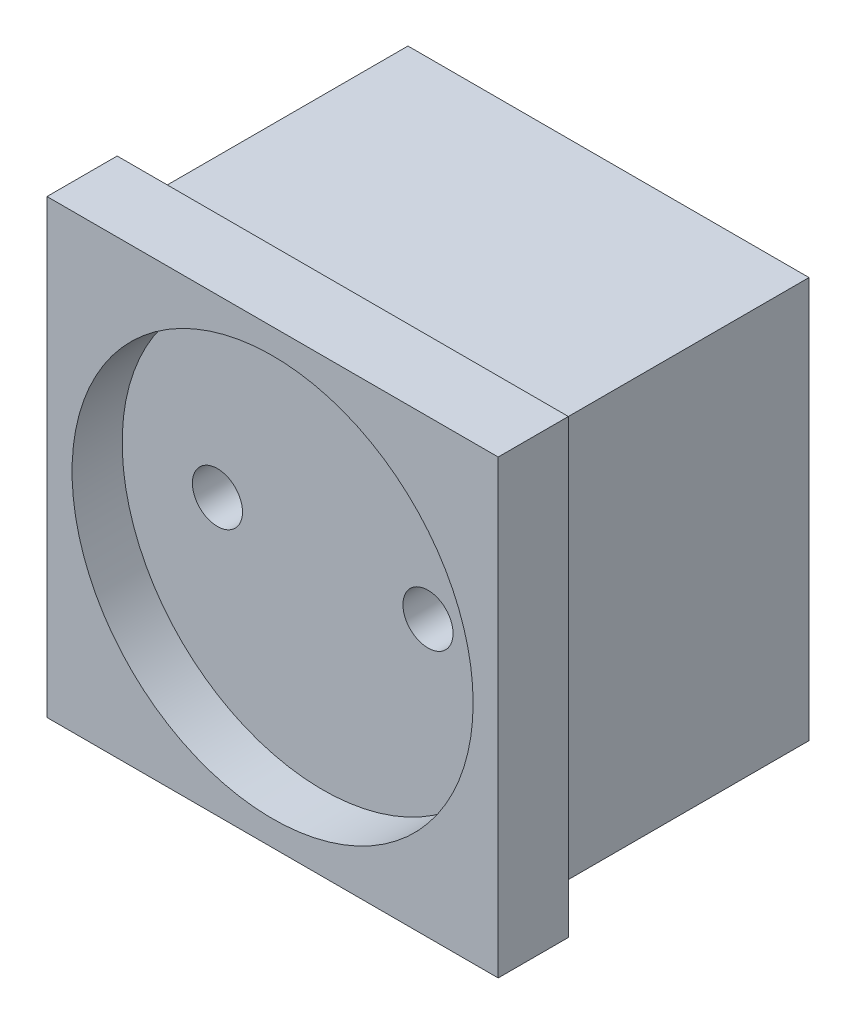
ISO-10303-21;
HEADER;
FILE_DESCRIPTION(('STEP AP214'),'2;1');
FILE_NAME('part.step','',(''),(''),'','','');
FILE_SCHEMA(('AUTOMOTIVE_DESIGN { 1 0 10303 214 1 1 1 1 }'));
ENDSEC;
DATA;
#1=APPLICATION_CONTEXT('core data for automotive mechanical design processes');
#2=APPLICATION_PROTOCOL_DEFINITION('international standard','automotive_design',2000,#1);
#3=PRODUCT_CONTEXT('',#1,'mechanical');
#4=PRODUCT('Part','Part','',(#3));
#5=PRODUCT_RELATED_PRODUCT_CATEGORY('part','',(#4));
#6=PRODUCT_DEFINITION_FORMATION('','',#4);
#7=PRODUCT_DEFINITION_CONTEXT('part definition',#1,'design');
#8=PRODUCT_DEFINITION('design','',#6,#7);
#9=PRODUCT_DEFINITION_SHAPE('','',#8);
#10=(LENGTH_UNIT() NAMED_UNIT(*) SI_UNIT(.MILLI.,.METRE.));
#11=(NAMED_UNIT(*) PLANE_ANGLE_UNIT() SI_UNIT($,.RADIAN.));
#12=(NAMED_UNIT(*) SI_UNIT($,.STERADIAN.) SOLID_ANGLE_UNIT());
#13=UNCERTAINTY_MEASURE_WITH_UNIT(LENGTH_MEASURE(1.E-05),#10,'distance_accuracy_value','');
#14=(GEOMETRIC_REPRESENTATION_CONTEXT(3) GLOBAL_UNCERTAINTY_ASSIGNED_CONTEXT((#13)) GLOBAL_UNIT_ASSIGNED_CONTEXT((#10,
#11,#12)) REPRESENTATION_CONTEXT('',''));
#15=CARTESIAN_POINT('',(0.,0.,0.));
#16=DIRECTION('',(0.,0.,1.));
#17=DIRECTION('',(1.,0.,0.));
#18=AXIS2_PLACEMENT_3D('',#15,#16,#17);
#19=CARTESIAN_POINT('',(20.,-20.,33.5));
#20=DIRECTION('',(-1.,0.,0.));
#21=DIRECTION('',(0.,0.,1.));
#22=AXIS2_PLACEMENT_3D('',#19,#20,#21);
#23=PLANE('',#22);
#24=DIRECTION('',(0.,1.,0.));
#25=VECTOR('',#24,1.);
#26=CARTESIAN_POINT('',(20.,-20.,26.5));
#27=LINE('',#26,#25);
#28=CARTESIAN_POINT('',(20.,-20.,26.5));
#29=VERTEX_POINT('',#28);
#30=CARTESIAN_POINT('',(20.,20.,26.5));
#31=VERTEX_POINT('',#30);
#32=EDGE_CURVE('E168',#29,#31,#27,.T.);
#33=ORIENTED_EDGE('',*,*,#32,.F.);
#34=DIRECTION('',(0.,0.,-1.));
#35=VECTOR('',#34,1.);
#36=CARTESIAN_POINT('',(20.,-20.,33.5));
#37=LINE('',#36,#35);
#38=CARTESIAN_POINT('',(20.,-20.,0.));
#39=VERTEX_POINT('',#38);
#40=EDGE_CURVE('E188',#29,#39,#37,.T.);
#41=ORIENTED_EDGE('',*,*,#40,.T.);
#42=DIRECTION('',(0.,1.,0.));
#43=VECTOR('',#42,1.);
#44=CARTESIAN_POINT('',(20.,-20.,0.));
#45=LINE('',#44,#43);
#46=CARTESIAN_POINT('',(20.,20.,0.));
#47=VERTEX_POINT('',#46);
#48=EDGE_CURVE('E172',#39,#47,#45,.T.);
#49=ORIENTED_EDGE('',*,*,#48,.T.);
#50=DIRECTION('',(0.,0.,-1.));
#51=VECTOR('',#50,1.);
#52=CARTESIAN_POINT('',(20.,20.,33.5));
#53=LINE('',#52,#51);
#54=EDGE_CURVE('E47',#31,#47,#53,.T.);
#55=ORIENTED_EDGE('',*,*,#54,.F.);
#56=EDGE_LOOP('',(#33,#41,#49,#55));
#57=FACE_BOUND('',#56,.T.);
#58=ADVANCED_FACE('F39',(#57),#23,.F.);
#59=CARTESIAN_POINT('',(-20.,20.,33.5));
#60=DIRECTION('',(0.,-1.,0.));
#61=DIRECTION('',(0.,0.,-1.));
#62=AXIS2_PLACEMENT_3D('',#59,#60,#61);
#63=PLANE('',#62);
#64=DIRECTION('',(-1.,0.,0.));
#65=VECTOR('',#64,1.);
#66=CARTESIAN_POINT('',(-20.,20.,26.5));
#67=LINE('',#66,#65);
#68=CARTESIAN_POINT('',(-20.,20.,26.5));
#69=VERTEX_POINT('',#68);
#70=EDGE_CURVE('E54',#31,#69,#67,.T.);
#71=ORIENTED_EDGE('',*,*,#70,.F.);
#72=ORIENTED_EDGE('',*,*,#54,.T.);
#73=DIRECTION('',(-1.,0.,0.));
#74=VECTOR('',#73,1.);
#75=CARTESIAN_POINT('',(-20.,20.,0.));
#76=LINE('',#75,#74);
#77=CARTESIAN_POINT('',(-20.,20.,0.));
#78=VERTEX_POINT('',#77);
#79=EDGE_CURVE('E176',#47,#78,#76,.T.);
#80=ORIENTED_EDGE('',*,*,#79,.T.);
#81=DIRECTION('',(0.,0.,-1.));
#82=VECTOR('',#81,1.);
#83=CARTESIAN_POINT('',(-20.,20.,33.5));
#84=LINE('',#83,#82);
#85=EDGE_CURVE('E194',#69,#78,#84,.T.);
#86=ORIENTED_EDGE('',*,*,#85,.F.);
#87=EDGE_LOOP('',(#71,#72,#80,#86));
#88=FACE_BOUND('',#87,.T.);
#89=ADVANCED_FACE('F198',(#88),#63,.F.);
#90=CARTESIAN_POINT('',(-20.,-20.,33.5));
#91=DIRECTION('',(1.,0.,0.));
#92=DIRECTION('',(0.,0.,-1.));
#93=AXIS2_PLACEMENT_3D('',#90,#91,#92);
#94=PLANE('',#93);
#95=DIRECTION('',(0.,-1.,0.));
#96=VECTOR('',#95,1.);
#97=CARTESIAN_POINT('',(-20.,-20.,26.5));
#98=LINE('',#97,#96);
#99=CARTESIAN_POINT('',(-20.,-20.,26.5));
#100=VERTEX_POINT('',#99);
#101=EDGE_CURVE('E62',#69,#100,#98,.T.);
#102=ORIENTED_EDGE('',*,*,#101,.F.);
#103=ORIENTED_EDGE('',*,*,#85,.T.);
#104=DIRECTION('',(0.,-1.,0.));
#105=VECTOR('',#104,1.);
#106=CARTESIAN_POINT('',(-20.,-20.,0.));
#107=LINE('',#106,#105);
#108=CARTESIAN_POINT('',(-20.,-20.,0.));
#109=VERTEX_POINT('',#108);
#110=EDGE_CURVE('E180',#78,#109,#107,.T.);
#111=ORIENTED_EDGE('',*,*,#110,.T.);
#112=DIRECTION('',(0.,0.,-1.));
#113=VECTOR('',#112,1.);
#114=CARTESIAN_POINT('',(-20.,-20.,33.5));
#115=LINE('',#114,#113);
#116=EDGE_CURVE('E191',#100,#109,#115,.T.);
#117=ORIENTED_EDGE('',*,*,#116,.F.);
#118=EDGE_LOOP('',(#102,#103,#111,#117));
#119=FACE_BOUND('',#118,.T.);
#120=ADVANCED_FACE('F208',(#119),#94,.F.);
#121=CARTESIAN_POINT('',(-20.,-20.,33.5));
#122=DIRECTION('',(0.,1.,0.));
#123=DIRECTION('',(0.,0.,1.));
#124=AXIS2_PLACEMENT_3D('',#121,#122,#123);
#125=PLANE('',#124);
#126=DIRECTION('',(1.,0.,0.));
#127=VECTOR('',#126,1.);
#128=CARTESIAN_POINT('',(-20.,-20.,26.5));
#129=LINE('',#128,#127);
#130=EDGE_CURVE('E11',#100,#29,#129,.T.);
#131=ORIENTED_EDGE('',*,*,#130,.F.);
#132=ORIENTED_EDGE('',*,*,#116,.T.);
#133=DIRECTION('',(1.,0.,0.));
#134=VECTOR('',#133,1.);
#135=CARTESIAN_POINT('',(-20.,-20.,0.));
#136=LINE('',#135,#134);
#137=EDGE_CURVE('E184',#109,#39,#136,.T.);
#138=ORIENTED_EDGE('',*,*,#137,.T.);
#139=ORIENTED_EDGE('',*,*,#40,.F.);
#140=EDGE_LOOP('',(#131,#132,#138,#139));
#141=FACE_BOUND('',#140,.T.);
#142=ADVANCED_FACE('F207',(#141),#125,.F.);
#143=CARTESIAN_POINT('',(0.,0.,0.));
#144=DIRECTION('',(0.,0.,-1.));
#145=DIRECTION('',(-1.,0.,0.));
#146=AXIS2_PLACEMENT_3D('',#143,#144,#145);
#147=PLANE('',#146);
#148=ORIENTED_EDGE('',*,*,#48,.F.);
#149=ORIENTED_EDGE('',*,*,#137,.F.);
#150=ORIENTED_EDGE('',*,*,#110,.F.);
#151=ORIENTED_EDGE('',*,*,#79,.F.);
#152=EDGE_LOOP('',(#148,#149,#150,#151));
#153=FACE_BOUND('',#152,.T.);
#154=ADVANCED_FACE('F204',(#153),#147,.T.);
#155=CARTESIAN_POINT('',(0.,0.,26.5));
#156=DIRECTION('',(0.,0.,1.));
#157=DIRECTION('',(1.,0.,0.));
#158=AXIS2_PLACEMENT_3D('',#155,#156,#157);
#159=PLANE('',#158);
#160=DIRECTION('',(0.,-1.,0.));
#161=VECTOR('',#160,1.);
#162=CARTESIAN_POINT('',(-22.5,-22.5,26.5));
#163=LINE('',#162,#161);
#164=CARTESIAN_POINT('',(-22.5,22.5,26.5));
#165=VERTEX_POINT('',#164);
#166=CARTESIAN_POINT('',(-22.5,-22.5,26.5));
#167=VERTEX_POINT('',#166);
#168=EDGE_CURVE('E125',#165,#167,#163,.T.);
#169=ORIENTED_EDGE('',*,*,#168,.F.);
#170=DIRECTION('',(-1.,0.,0.));
#171=VECTOR('',#170,1.);
#172=CARTESIAN_POINT('',(22.5,22.5,26.5));
#173=LINE('',#172,#171);
#174=CARTESIAN_POINT('',(22.5,22.5,26.5));
#175=VERTEX_POINT('',#174);
#176=EDGE_CURVE('E117',#175,#165,#173,.T.);
#177=ORIENTED_EDGE('',*,*,#176,.F.);
#178=DIRECTION('',(0.,1.,0.));
#179=VECTOR('',#178,1.);
#180=CARTESIAN_POINT('',(22.5,-22.5,26.5));
#181=LINE('',#180,#179);
#182=CARTESIAN_POINT('',(22.5,-22.5,26.5));
#183=VERTEX_POINT('',#182);
#184=EDGE_CURVE('E128',#183,#175,#181,.T.);
#185=ORIENTED_EDGE('',*,*,#184,.F.);
#186=DIRECTION('',(1.,0.,0.));
#187=VECTOR('',#186,1.);
#188=CARTESIAN_POINT('',(22.5,-22.5,26.5));
#189=LINE('',#188,#187);
#190=EDGE_CURVE('E108',#167,#183,#189,.T.);
#191=ORIENTED_EDGE('',*,*,#190,.F.);
#192=EDGE_LOOP('',(#169,#177,#185,#191));
#193=FACE_BOUND('',#192,.T.);
#194=ORIENTED_EDGE('',*,*,#130,.T.);
#195=ORIENTED_EDGE('',*,*,#32,.T.);
#196=ORIENTED_EDGE('',*,*,#70,.T.);
#197=ORIENTED_EDGE('',*,*,#101,.T.);
#198=EDGE_LOOP('',(#194,#195,#196,#197));
#199=FACE_BOUND('',#198,.T.);
#200=ADVANCED_FACE('F122',(#193,#199),#159,.F.);
#201=CARTESIAN_POINT('',(-22.5,-22.5,26.5));
#202=DIRECTION('',(-1.,0.,0.));
#203=DIRECTION('',(0.,0.,1.));
#204=AXIS2_PLACEMENT_3D('',#201,#202,#203);
#205=PLANE('',#204);
#206=DIRECTION('',(0.,-1.,0.));
#207=VECTOR('',#206,1.);
#208=CARTESIAN_POINT('',(-22.5,-22.5,33.5));
#209=LINE('',#208,#207);
#210=CARTESIAN_POINT('',(-22.5,22.5,33.5));
#211=VERTEX_POINT('',#210);
#212=CARTESIAN_POINT('',(-22.5,-22.5,33.5));
#213=VERTEX_POINT('',#212);
#214=EDGE_CURVE('E148',#211,#213,#209,.T.);
#215=ORIENTED_EDGE('',*,*,#214,.F.);
#216=DIRECTION('',(0.,0.,1.));
#217=VECTOR('',#216,1.);
#218=CARTESIAN_POINT('',(-22.5,22.5,26.5));
#219=LINE('',#218,#217);
#220=EDGE_CURVE('E132',#165,#211,#219,.T.);
#221=ORIENTED_EDGE('',*,*,#220,.F.);
#222=ORIENTED_EDGE('',*,*,#168,.T.);
#223=DIRECTION('',(0.,0.,1.));
#224=VECTOR('',#223,1.);
#225=CARTESIAN_POINT('',(-22.5,-22.5,26.5));
#226=LINE('',#225,#224);
#227=EDGE_CURVE('E105',#167,#213,#226,.T.);
#228=ORIENTED_EDGE('',*,*,#227,.T.);
#229=EDGE_LOOP('',(#215,#221,#222,#228));
#230=FACE_BOUND('',#229,.T.);
#231=ADVANCED_FACE('F131',(#230),#205,.T.);
#232=CARTESIAN_POINT('',(22.5,22.5,26.5));
#233=DIRECTION('',(0.,1.,0.));
#234=DIRECTION('',(-1.,0.,0.));
#235=AXIS2_PLACEMENT_3D('',#232,#233,#234);
#236=PLANE('',#235);
#237=DIRECTION('',(-1.,0.,0.));
#238=VECTOR('',#237,1.);
#239=CARTESIAN_POINT('',(22.5,22.5,33.5));
#240=LINE('',#239,#238);
#241=CARTESIAN_POINT('',(22.5,22.5,33.5));
#242=VERTEX_POINT('',#241);
#243=EDGE_CURVE('E134',#242,#211,#240,.T.);
#244=ORIENTED_EDGE('',*,*,#243,.F.);
#245=DIRECTION('',(0.,0.,1.));
#246=VECTOR('',#245,1.);
#247=CARTESIAN_POINT('',(22.5,22.5,26.5));
#248=LINE('',#247,#246);
#249=EDGE_CURVE('E159',#175,#242,#248,.T.);
#250=ORIENTED_EDGE('',*,*,#249,.F.);
#251=ORIENTED_EDGE('',*,*,#176,.T.);
#252=ORIENTED_EDGE('',*,*,#220,.T.);
#253=EDGE_LOOP('',(#244,#250,#251,#252));
#254=FACE_BOUND('',#253,.T.);
#255=ADVANCED_FACE('F215',(#254),#236,.T.);
#256=CARTESIAN_POINT('',(22.5,-22.5,26.5));
#257=DIRECTION('',(1.,0.,0.));
#258=DIRECTION('',(0.,0.,-1.));
#259=AXIS2_PLACEMENT_3D('',#256,#257,#258);
#260=PLANE('',#259);
#261=DIRECTION('',(0.,1.,0.));
#262=VECTOR('',#261,1.);
#263=CARTESIAN_POINT('',(22.5,-22.5,33.5));
#264=LINE('',#263,#262);
#265=CARTESIAN_POINT('',(22.5,-22.5,33.5));
#266=VERTEX_POINT('',#265);
#267=EDGE_CURVE('E138',#266,#242,#264,.T.);
#268=ORIENTED_EDGE('',*,*,#267,.F.);
#269=DIRECTION('',(0.,0.,1.));
#270=VECTOR('',#269,1.);
#271=CARTESIAN_POINT('',(22.5,-22.5,26.5));
#272=LINE('',#271,#270);
#273=EDGE_CURVE('E116',#183,#266,#272,.T.);
#274=ORIENTED_EDGE('',*,*,#273,.F.);
#275=ORIENTED_EDGE('',*,*,#184,.T.);
#276=ORIENTED_EDGE('',*,*,#249,.T.);
#277=EDGE_LOOP('',(#268,#274,#275,#276));
#278=FACE_BOUND('',#277,.T.);
#279=ADVANCED_FACE('F238',(#278),#260,.T.);
#280=CARTESIAN_POINT('',(22.5,-22.5,26.5));
#281=DIRECTION('',(0.,-1.,0.));
#282=DIRECTION('',(1.,0.,0.));
#283=AXIS2_PLACEMENT_3D('',#280,#281,#282);
#284=PLANE('',#283);
#285=DIRECTION('',(1.,0.,0.));
#286=VECTOR('',#285,1.);
#287=CARTESIAN_POINT('',(22.5,-22.5,33.5));
#288=LINE('',#287,#286);
#289=EDGE_CURVE('E110',#213,#266,#288,.T.);
#290=ORIENTED_EDGE('',*,*,#289,.F.);
#291=ORIENTED_EDGE('',*,*,#227,.F.);
#292=ORIENTED_EDGE('',*,*,#190,.T.);
#293=ORIENTED_EDGE('',*,*,#273,.T.);
#294=EDGE_LOOP('',(#290,#291,#292,#293));
#295=FACE_BOUND('',#294,.T.);
#296=ADVANCED_FACE('F107',(#295),#284,.T.);
#297=CARTESIAN_POINT('',(0.,0.,33.5));
#298=DIRECTION('',(0.,0.,-1.));
#299=DIRECTION('',(-1.,0.,0.));
#300=AXIS2_PLACEMENT_3D('',#297,#298,#299);
#301=PLANE('',#300);
#302=CARTESIAN_POINT('',(0.,0.,33.5));
#303=DIRECTION('',(0.,0.,1.));
#304=DIRECTION('',(1.,0.,0.));
#305=AXIS2_PLACEMENT_3D('',#302,#303,#304);
#306=CIRCLE('',#305,20.);
#307=CARTESIAN_POINT('',(20.,0.,33.5));
#308=VERTEX_POINT('',#307);
#309=EDGE_CURVE('E141',#308,#308,#306,.T.);
#310=ORIENTED_EDGE('',*,*,#309,.F.);
#311=EDGE_LOOP('',(#310));
#312=FACE_BOUND('',#311,.T.);
#313=ORIENTED_EDGE('',*,*,#214,.T.);
#314=ORIENTED_EDGE('',*,*,#289,.T.);
#315=ORIENTED_EDGE('',*,*,#267,.T.);
#316=ORIENTED_EDGE('',*,*,#243,.T.);
#317=EDGE_LOOP('',(#313,#314,#315,#316));
#318=FACE_BOUND('',#317,.T.);
#319=ADVANCED_FACE('F231',(#312,#318),#301,.F.);
#320=CARTESIAN_POINT('',(0.,0.,28.5));
#321=DIRECTION('',(0.,0.,1.));
#322=DIRECTION('',(1.,0.,0.));
#323=AXIS2_PLACEMENT_3D('',#320,#321,#322);
#324=CYLINDRICAL_SURFACE('',#323,20.);
#325=CARTESIAN_POINT('',(0.,0.,28.5));
#326=DIRECTION('',(0.,0.,1.));
#327=DIRECTION('',(1.,0.,0.));
#328=AXIS2_PLACEMENT_3D('',#325,#326,#327);
#329=CIRCLE('',#328,20.);
#330=CARTESIAN_POINT('',(20.,0.,28.5));
#331=VERTEX_POINT('',#330);
#332=EDGE_CURVE('E151',#331,#331,#329,.T.);
#333=ORIENTED_EDGE('',*,*,#332,.F.);
#334=EDGE_LOOP('',(#333));
#335=FACE_BOUND('',#334,.T.);
#336=ORIENTED_EDGE('',*,*,#309,.T.);
#337=EDGE_LOOP('',(#336));
#338=FACE_BOUND('',#337,.T.);
#339=ADVANCED_FACE('F233',(#335,#338),#324,.F.);
#340=CARTESIAN_POINT('',(0.,0.,28.5));
#341=DIRECTION('',(0.,0.,1.));
#342=DIRECTION('',(1.,0.,0.));
#343=AXIS2_PLACEMENT_3D('',#340,#341,#342);
#344=PLANE('',#343);
#345=CARTESIAN_POINT('',(-10.5,0.,28.5));
#346=DIRECTION('',(0.,0.,1.));
#347=DIRECTION('',(1.,0.,0.));
#348=AXIS2_PLACEMENT_3D('',#345,#346,#347);
#349=CIRCLE('',#348,2.5);
#350=CARTESIAN_POINT('',(-8.,0.,28.5));
#351=VERTEX_POINT('',#350);
#352=EDGE_CURVE('E371',#351,#351,#349,.T.);
#353=ORIENTED_EDGE('',*,*,#352,.F.);
#354=EDGE_LOOP('',(#353));
#355=FACE_BOUND('',#354,.T.);
#356=CARTESIAN_POINT('',(10.5,0.,28.5));
#357=DIRECTION('',(0.,0.,1.));
#358=DIRECTION('',(-1.,0.,0.));
#359=AXIS2_PLACEMENT_3D('',#356,#357,#358);
#360=CIRCLE('',#359,2.5);
#361=CARTESIAN_POINT('',(8.,0.,28.5));
#362=VERTEX_POINT('',#361);
#363=EDGE_CURVE('E383',#362,#362,#360,.T.);
#364=ORIENTED_EDGE('',*,*,#363,.F.);
#365=EDGE_LOOP('',(#364));
#366=FACE_BOUND('',#365,.T.);
#367=ORIENTED_EDGE('',*,*,#332,.T.);
#368=EDGE_LOOP('',(#367));
#369=FACE_BOUND('',#368,.T.);
#370=ADVANCED_FACE('F268',(#355,#366,#369),#344,.T.);
#371=CARTESIAN_POINT('',(10.5,0.,13.5));
#372=DIRECTION('',(0.,0.,1.));
#373=DIRECTION('',(1.,0.,0.));
#374=AXIS2_PLACEMENT_3D('',#371,#372,#373);
#375=CYLINDRICAL_SURFACE('',#374,2.5);
#376=CARTESIAN_POINT('',(10.5,0.,13.5));
#377=DIRECTION('',(0.,0.,1.));
#378=DIRECTION('',(-1.,0.,0.));
#379=AXIS2_PLACEMENT_3D('',#376,#377,#378);
#380=CIRCLE('',#379,2.5);
#381=CARTESIAN_POINT('',(8.,0.,13.5));
#382=VERTEX_POINT('',#381);
#383=EDGE_CURVE('E377',#382,#382,#380,.T.);
#384=ORIENTED_EDGE('',*,*,#383,.F.);
#385=EDGE_LOOP('',(#384));
#386=FACE_BOUND('',#385,.T.);
#387=ORIENTED_EDGE('',*,*,#363,.T.);
#388=EDGE_LOOP('',(#387));
#389=FACE_BOUND('',#388,.T.);
#390=ADVANCED_FACE('F275',(#386,#389),#375,.F.);
#391=CARTESIAN_POINT('',(10.5,0.,13.5));
#392=DIRECTION('',(0.,0.,-1.));
#393=DIRECTION('',(-1.,0.,0.));
#394=AXIS2_PLACEMENT_3D('',#391,#392,#393);
#395=PLANE('',#394);
#396=ORIENTED_EDGE('',*,*,#383,.T.);
#397=EDGE_LOOP('',(#396));
#398=FACE_BOUND('',#397,.T.);
#399=ADVANCED_FACE('F283',(#398),#395,.F.);
#400=CARTESIAN_POINT('',(-10.5,0.,13.5));
#401=DIRECTION('',(0.,0.,1.));
#402=DIRECTION('',(1.,0.,0.));
#403=AXIS2_PLACEMENT_3D('',#400,#401,#402);
#404=CYLINDRICAL_SURFACE('',#403,2.5);
#405=CARTESIAN_POINT('',(-10.5,0.,13.5));
#406=DIRECTION('',(0.,0.,1.));
#407=DIRECTION('',(1.,0.,0.));
#408=AXIS2_PLACEMENT_3D('',#405,#406,#407);
#409=CIRCLE('',#408,2.5);
#410=CARTESIAN_POINT('',(-8.,0.,13.5));
#411=VERTEX_POINT('',#410);
#412=EDGE_CURVE('E369',#411,#411,#409,.T.);
#413=ORIENTED_EDGE('',*,*,#412,.F.);
#414=EDGE_LOOP('',(#413));
#415=FACE_BOUND('',#414,.T.);
#416=ORIENTED_EDGE('',*,*,#352,.T.);
#417=EDGE_LOOP('',(#416));
#418=FACE_BOUND('',#417,.T.);
#419=ADVANCED_FACE('F291',(#415,#418),#404,.F.);
#420=CARTESIAN_POINT('',(-10.5,0.,13.5));
#421=DIRECTION('',(0.,0.,1.));
#422=DIRECTION('',(1.,0.,0.));
#423=AXIS2_PLACEMENT_3D('',#420,#421,#422);
#424=PLANE('',#423);
#425=ORIENTED_EDGE('',*,*,#412,.T.);
#426=EDGE_LOOP('',(#425));
#427=FACE_BOUND('',#426,.T.);
#428=ADVANCED_FACE('F299',(#427),#424,.T.);
#429=CLOSED_SHELL('',(#58,#89,#120,#142,#154,#200,#231,#255,#279,#296,#319,#339,#370,#390,#399,
#419,#428));
#430=MANIFOLD_SOLID_BREP('B2',#429);
#431=ADVANCED_BREP_SHAPE_REPRESENTATION('',(#18,#430),#14);
#432=SHAPE_DEFINITION_REPRESENTATION(#9,#431);
ENDSEC;
END-ISO-10303-21;
